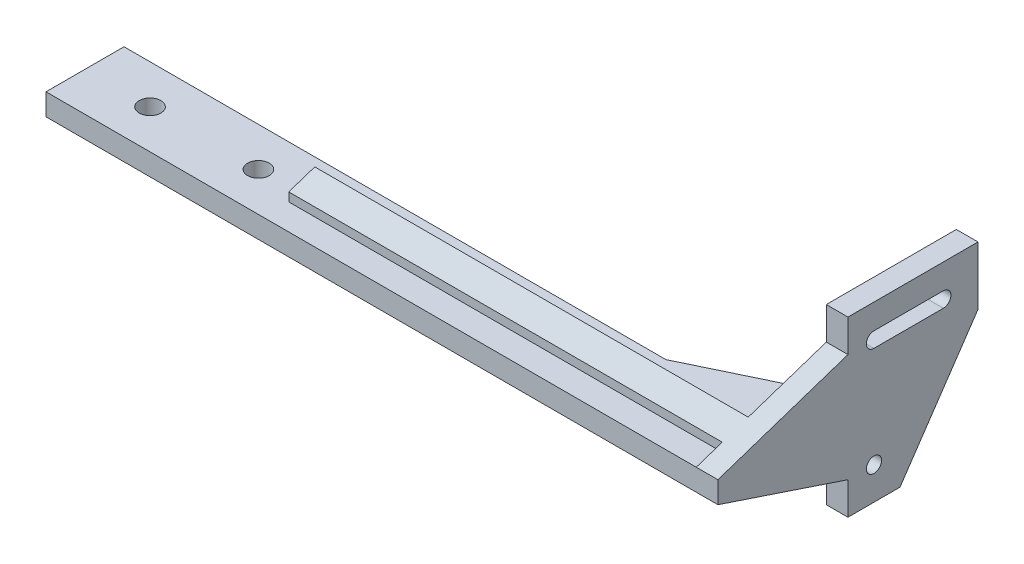
ISO-10303-21;
HEADER;
FILE_DESCRIPTION(('STEP AP214'),'2;1');
FILE_NAME('part.step','',(''),(''),'','','');
FILE_SCHEMA(('AUTOMOTIVE_DESIGN { 1 0 10303 214 1 1 1 1 }'));
ENDSEC;
DATA;
#1=APPLICATION_CONTEXT('core data for automotive mechanical design processes');
#2=APPLICATION_PROTOCOL_DEFINITION('international standard','automotive_design',2000,#1);
#3=PRODUCT_CONTEXT('',#1,'mechanical');
#4=PRODUCT('Part','Part','',(#3));
#5=PRODUCT_RELATED_PRODUCT_CATEGORY('part','',(#4));
#6=PRODUCT_DEFINITION_FORMATION('','',#4);
#7=PRODUCT_DEFINITION_CONTEXT('part definition',#1,'design');
#8=PRODUCT_DEFINITION('design','',#6,#7);
#9=PRODUCT_DEFINITION_SHAPE('','',#8);
#10=(LENGTH_UNIT() NAMED_UNIT(*) SI_UNIT(.MILLI.,.METRE.));
#11=(NAMED_UNIT(*) PLANE_ANGLE_UNIT() SI_UNIT($,.RADIAN.));
#12=(NAMED_UNIT(*) SI_UNIT($,.STERADIAN.) SOLID_ANGLE_UNIT());
#13=UNCERTAINTY_MEASURE_WITH_UNIT(LENGTH_MEASURE(1.E-05),#10,'distance_accuracy_value','');
#14=(GEOMETRIC_REPRESENTATION_CONTEXT(3) GLOBAL_UNCERTAINTY_ASSIGNED_CONTEXT((#13)) GLOBAL_UNIT_ASSIGNED_CONTEXT((#10,
#11,#12)) REPRESENTATION_CONTEXT('',''));
#15=CARTESIAN_POINT('',(0.,0.,0.));
#16=DIRECTION('',(0.,0.,1.));
#17=DIRECTION('',(1.,0.,0.));
#18=AXIS2_PLACEMENT_3D('',#15,#16,#17);
#19=CARTESIAN_POINT('',(0.,5.,0.));
#20=DIRECTION('',(0.,1.,0.));
#21=DIRECTION('',(0.,0.,1.));
#22=AXIS2_PLACEMENT_3D('',#19,#20,#21);
#23=PLANE('',#22);
#24=CARTESIAN_POINT('',(15.,5.,9.));
#25=DIRECTION('',(0.,1.,0.));
#26=DIRECTION('',(0.,0.,1.));
#27=AXIS2_PLACEMENT_3D('',#24,#25,#26);
#28=CIRCLE('',#27,2.5);
#29=CARTESIAN_POINT('',(15.,5.,11.5));
#30=VERTEX_POINT('',#29);
#31=EDGE_CURVE('E392',#30,#30,#28,.T.);
#32=ORIENTED_EDGE('',*,*,#31,.F.);
#33=EDGE_LOOP('',(#32));
#34=FACE_BOUND('',#33,.T.);
#35=CARTESIAN_POINT('',(40.,5.,8.99999999999999));
#36=DIRECTION('',(0.,1.,0.));
#37=DIRECTION('',(0.,0.,1.));
#38=AXIS2_PLACEMENT_3D('',#35,#36,#37);
#39=CIRCLE('',#38,2.5);
#40=CARTESIAN_POINT('',(40.,5.,11.5));
#41=VERTEX_POINT('',#40);
#42=EDGE_CURVE('E388',#41,#41,#39,.T.);
#43=ORIENTED_EDGE('',*,*,#42,.F.);
#44=EDGE_LOOP('',(#43));
#45=FACE_BOUND('',#44,.T.);
#46=DIRECTION('',(0.,0.,-1.));
#47=VECTOR('',#46,1.);
#48=CARTESIAN_POINT('',(150.,5.,18.));
#49=LINE('',#48,#47);
#50=CARTESIAN_POINT('',(150.,5.,18.));
#51=VERTEX_POINT('',#50);
#52=CARTESIAN_POINT('',(150.,5.,12.));
#53=VERTEX_POINT('',#52);
#54=EDGE_CURVE('E412',#51,#53,#49,.T.);
#55=ORIENTED_EDGE('',*,*,#54,.T.);
#56=DIRECTION('',(1.,0.,0.));
#57=VECTOR('',#56,1.);
#58=CARTESIAN_POINT('',(50.,5.,12.));
#59=LINE('',#58,#57);
#60=CARTESIAN_POINT('',(50.,5.,12.));
#61=VERTEX_POINT('',#60);
#62=EDGE_CURVE('E244',#61,#53,#59,.T.);
#63=ORIENTED_EDGE('',*,*,#62,.F.);
#64=DIRECTION('',(0.,0.,1.));
#65=VECTOR('',#64,1.);
#66=CARTESIAN_POINT('',(50.,5.,12.));
#67=LINE('',#66,#65);
#68=CARTESIAN_POINT('',(50.,5.,5.99999999999999));
#69=VERTEX_POINT('',#68);
#70=EDGE_CURVE('E220',#69,#61,#67,.T.);
#71=ORIENTED_EDGE('',*,*,#70,.F.);
#72=DIRECTION('',(1.,0.,0.));
#73=VECTOR('',#72,1.);
#74=CARTESIAN_POINT('',(50.,5.,5.99999999999999));
#75=LINE('',#74,#73);
#76=CARTESIAN_POINT('',(150.,5.,5.99999999999999));
#77=VERTEX_POINT('',#76);
#78=EDGE_CURVE('E232',#69,#77,#75,.T.);
#79=ORIENTED_EDGE('',*,*,#78,.T.);
#80=CARTESIAN_POINT('',(150.,5.,-12.));
#81=VERTEX_POINT('',#80);
#82=EDGE_CURVE('E55',#77,#81,#49,.T.);
#83=ORIENTED_EDGE('',*,*,#82,.T.);
#84=DIRECTION('',(-0.901523057468274,0.,0.432731067584771));
#85=VECTOR('',#84,1.);
#86=CARTESIAN_POINT('',(150.,5.,-12.));
#87=LINE('',#86,#85);
#88=CARTESIAN_POINT('',(125.,5.,0.));
#89=VERTEX_POINT('',#88);
#90=EDGE_CURVE('E215',#81,#89,#87,.T.);
#91=ORIENTED_EDGE('',*,*,#90,.T.);
#92=DIRECTION('',(-1.,0.,0.));
#93=VECTOR('',#92,1.);
#94=CARTESIAN_POINT('',(150.,5.,0.));
#95=LINE('',#94,#93);
#96=CARTESIAN_POINT('',(0.,5.,0.));
#97=VERTEX_POINT('',#96);
#98=EDGE_CURVE('E200',#89,#97,#95,.T.);
#99=ORIENTED_EDGE('',*,*,#98,.T.);
#100=DIRECTION('',(0.,0.,1.));
#101=VECTOR('',#100,1.);
#102=CARTESIAN_POINT('',(0.,5.,0.));
#103=LINE('',#102,#101);
#104=CARTESIAN_POINT('',(0.,5.,18.));
#105=VERTEX_POINT('',#104);
#106=EDGE_CURVE('E405',#97,#105,#103,.T.);
#107=ORIENTED_EDGE('',*,*,#106,.T.);
#108=DIRECTION('',(1.,0.,0.));
#109=VECTOR('',#108,1.);
#110=CARTESIAN_POINT('',(0.,5.,18.));
#111=LINE('',#110,#109);
#112=EDGE_CURVE('E408',#105,#51,#111,.T.);
#113=ORIENTED_EDGE('',*,*,#112,.T.);
#114=EDGE_LOOP('',(#55,#63,#71,#79,#83,#91,#99,#107,#113));
#115=FACE_BOUND('',#114,.T.);
#116=ADVANCED_FACE('F39',(#34,#45,#115),#23,.T.);
#117=CARTESIAN_POINT('',(150.,0.,0.));
#118=DIRECTION('',(1.,0.,0.));
#119=DIRECTION('',(0.,0.,-1.));
#120=AXIS2_PLACEMENT_3D('',#117,#118,#119);
#121=PLANE('',#120);
#122=DIRECTION('',(0.,1.,0.));
#123=VECTOR('',#122,1.);
#124=CARTESIAN_POINT('',(150.,7.00000000000001,12.));
#125=LINE('',#124,#123);
#126=CARTESIAN_POINT('',(150.,7.,12.));
#127=VERTEX_POINT('',#126);
#128=EDGE_CURVE('E208',#53,#127,#125,.T.);
#129=ORIENTED_EDGE('',*,*,#128,.F.);
#130=ORIENTED_EDGE('',*,*,#54,.F.);
#131=DIRECTION('',(0.,-0.316227766016838,0.948683298050514));
#132=VECTOR('',#131,1.);
#133=CARTESIAN_POINT('',(150.,5.,18.));
#134=LINE('',#133,#132);
#135=EDGE_CURVE('E332',#127,#51,#134,.T.);
#136=ORIENTED_EDGE('',*,*,#135,.F.);
#137=EDGE_LOOP('',(#129,#130,#136));
#138=FACE_BOUND('',#137,.T.);
#139=ADVANCED_FACE('F439',(#138),#121,.F.);
#140=DIRECTION('',(0.,0.,-1.));
#141=VECTOR('',#140,1.);
#142=CARTESIAN_POINT('',(150.,16.75,-18.));
#143=LINE('',#142,#141);
#144=CARTESIAN_POINT('',(150.,16.75,-18.));
#145=VERTEX_POINT('',#144);
#146=CARTESIAN_POINT('',(150.,16.75,-34.));
#147=VERTEX_POINT('',#146);
#148=EDGE_CURVE('E260',#145,#147,#143,.T.);
#149=ORIENTED_EDGE('',*,*,#148,.F.);
#150=CARTESIAN_POINT('',(150.,15.,-18.));
#151=DIRECTION('',(1.,0.,0.));
#152=DIRECTION('',(0.,0.,-1.));
#153=AXIS2_PLACEMENT_3D('',#150,#151,#152);
#154=CIRCLE('',#153,1.75);
#155=CARTESIAN_POINT('',(150.,13.25,-18.));
#156=VERTEX_POINT('',#155);
#157=EDGE_CURVE('E264',#156,#145,#154,.F.);
#158=ORIENTED_EDGE('',*,*,#157,.F.);
#159=DIRECTION('',(0.,0.,1.));
#160=VECTOR('',#159,1.);
#161=CARTESIAN_POINT('',(150.,13.25,-18.));
#162=LINE('',#161,#160);
#163=CARTESIAN_POINT('',(150.,13.25,-34.));
#164=VERTEX_POINT('',#163);
#165=EDGE_CURVE('E253',#164,#156,#162,.T.);
#166=ORIENTED_EDGE('',*,*,#165,.F.);
#167=CARTESIAN_POINT('',(150.,15.,-34.));
#168=DIRECTION('',(1.,0.,0.));
#169=DIRECTION('',(0.,0.,-1.));
#170=AXIS2_PLACEMENT_3D('',#167,#168,#169);
#171=CIRCLE('',#170,1.75);
#172=EDGE_CURVE('E247',#147,#164,#171,.F.);
#173=ORIENTED_EDGE('',*,*,#172,.F.);
#174=EDGE_LOOP('',(#149,#158,#166,#173));
#175=FACE_BOUND('',#174,.T.);
#176=CARTESIAN_POINT('',(150.,-10.,-18.));
#177=DIRECTION('',(1.,0.,0.));
#178=DIRECTION('',(0.,0.,-1.));
#179=AXIS2_PLACEMENT_3D('',#176,#177,#178);
#180=CIRCLE('',#179,1.75);
#181=CARTESIAN_POINT('',(150.,-10.,-19.75));
#182=VERTEX_POINT('',#181);
#183=EDGE_CURVE('E252',#182,#182,#180,.F.);
#184=ORIENTED_EDGE('',*,*,#183,.F.);
#185=EDGE_LOOP('',(#184));
#186=FACE_BOUND('',#185,.T.);
#187=DIRECTION('',(0.,1.,0.));
#188=VECTOR('',#187,1.);
#189=CARTESIAN_POINT('',(150.,-27.7308492477241,-12.));
#190=LINE('',#189,#188);
#191=CARTESIAN_POINT('',(150.,0.,-12.));
#192=VERTEX_POINT('',#191);
#193=EDGE_CURVE('E204',#192,#81,#190,.T.);
#194=ORIENTED_EDGE('',*,*,#193,.T.);
#195=ORIENTED_EDGE('',*,*,#82,.F.);
#196=DIRECTION('',(0.,-1.,0.));
#197=VECTOR('',#196,1.);
#198=CARTESIAN_POINT('',(150.,9.00000000000001,5.99999999999999));
#199=LINE('',#198,#197);
#200=CARTESIAN_POINT('',(150.,9.00000000000001,5.99999999999999));
#201=VERTEX_POINT('',#200);
#202=EDGE_CURVE('E212',#201,#77,#199,.T.);
#203=ORIENTED_EDGE('',*,*,#202,.F.);
#204=CARTESIAN_POINT('',(150.,15.,-12.));
#205=VERTEX_POINT('',#204);
#206=EDGE_CURVE('E333',#205,#201,#134,.T.);
#207=ORIENTED_EDGE('',*,*,#206,.F.);
#208=DIRECTION('',(0.,-1.,0.));
#209=VECTOR('',#208,1.);
#210=CARTESIAN_POINT('',(150.,15.,-12.));
#211=LINE('',#210,#209);
#212=CARTESIAN_POINT('',(150.,22.5,-12.));
#213=VERTEX_POINT('',#212);
#214=EDGE_CURVE('E257',#213,#205,#211,.T.);
#215=ORIENTED_EDGE('',*,*,#214,.F.);
#216=DIRECTION('',(0.,0.,1.));
#217=VECTOR('',#216,1.);
#218=CARTESIAN_POINT('',(150.,22.5,-24.));
#219=LINE('',#218,#217);
#220=CARTESIAN_POINT('',(150.,22.5,-42.));
#221=VERTEX_POINT('',#220);
#222=EDGE_CURVE('E304',#221,#213,#219,.T.);
#223=ORIENTED_EDGE('',*,*,#222,.F.);
#224=DIRECTION('',(0.,1.,0.));
#225=VECTOR('',#224,1.);
#226=CARTESIAN_POINT('',(150.,9.02980585679813,-42.));
#227=LINE('',#226,#225);
#228=CARTESIAN_POINT('',(150.,9.02980585679813,-42.));
#229=VERTEX_POINT('',#228);
#230=EDGE_CURVE('E349',#229,#221,#227,.T.);
#231=ORIENTED_EDGE('',*,*,#230,.F.);
#232=DIRECTION('',(0.,0.827510095016723,-0.561450837247051));
#233=VECTOR('',#232,1.);
#234=CARTESIAN_POINT('',(150.,-17.5,-24.));
#235=LINE('',#234,#233);
#236=CARTESIAN_POINT('',(150.,-17.5,-24.));
#237=VERTEX_POINT('',#236);
#238=EDGE_CURVE('E346',#237,#229,#235,.T.);
#239=ORIENTED_EDGE('',*,*,#238,.F.);
#240=DIRECTION('',(0.,0.,-1.));
#241=VECTOR('',#240,1.);
#242=CARTESIAN_POINT('',(150.,-17.5,-24.));
#243=LINE('',#242,#241);
#244=CARTESIAN_POINT('',(150.,-17.5,-12.));
#245=VERTEX_POINT('',#244);
#246=EDGE_CURVE('E343',#245,#237,#243,.T.);
#247=ORIENTED_EDGE('',*,*,#246,.F.);
#248=DIRECTION('',(0.,-1.,0.));
#249=VECTOR('',#248,1.);
#250=CARTESIAN_POINT('',(150.,-17.5,-12.));
#251=LINE('',#250,#249);
#252=CARTESIAN_POINT('',(150.,-10.,-12.));
#253=VERTEX_POINT('',#252);
#254=EDGE_CURVE('E340',#253,#245,#251,.T.);
#255=ORIENTED_EDGE('',*,*,#254,.F.);
#256=DIRECTION('',(0.,-0.316227766016838,-0.948683298050514));
#257=VECTOR('',#256,1.);
#258=CARTESIAN_POINT('',(150.,0.,18.));
#259=LINE('',#258,#257);
#260=CARTESIAN_POINT('',(150.,0.,18.));
#261=VERTEX_POINT('',#260);
#262=EDGE_CURVE('E337',#261,#253,#259,.T.);
#263=ORIENTED_EDGE('',*,*,#262,.F.);
#264=DIRECTION('',(0.,0.,-1.));
#265=VECTOR('',#264,1.);
#266=CARTESIAN_POINT('',(150.,0.,18.));
#267=LINE('',#266,#265);
#268=EDGE_CURVE('E62',#261,#192,#267,.T.);
#269=ORIENTED_EDGE('',*,*,#268,.T.);
#270=EDGE_LOOP('',(#194,#195,#203,#207,#215,#223,#231,#239,#247,#255,#263,#269));
#271=FACE_BOUND('',#270,.T.);
#272=ADVANCED_FACE('F458',(#175,#186,#271),#121,.F.);
#273=CARTESIAN_POINT('',(150.,5.,0.));
#274=DIRECTION('',(0.,0.,1.));
#275=DIRECTION('',(1.,0.,0.));
#276=AXIS2_PLACEMENT_3D('',#273,#274,#275);
#277=PLANE('',#276);
#278=ORIENTED_EDGE('',*,*,#98,.F.);
#279=DIRECTION('',(0.,1.,0.));
#280=VECTOR('',#279,1.);
#281=CARTESIAN_POINT('',(125.,-27.7308492477241,0.));
#282=LINE('',#281,#280);
#283=CARTESIAN_POINT('',(125.,0.,0.));
#284=VERTEX_POINT('',#283);
#285=EDGE_CURVE('E199',#284,#89,#282,.T.);
#286=ORIENTED_EDGE('',*,*,#285,.F.);
#287=DIRECTION('',(-1.,0.,0.));
#288=VECTOR('',#287,1.);
#289=CARTESIAN_POINT('',(150.,0.,0.));
#290=LINE('',#289,#288);
#291=CARTESIAN_POINT('',(0.,0.,0.));
#292=VERTEX_POINT('',#291);
#293=EDGE_CURVE('E185',#284,#292,#290,.T.);
#294=ORIENTED_EDGE('',*,*,#293,.T.);
#295=DIRECTION('',(0.,-1.,0.));
#296=VECTOR('',#295,1.);
#297=CARTESIAN_POINT('',(0.,5.,0.));
#298=LINE('',#297,#296);
#299=EDGE_CURVE('E11',#97,#292,#298,.T.);
#300=ORIENTED_EDGE('',*,*,#299,.F.);
#301=EDGE_LOOP('',(#278,#286,#294,#300));
#302=FACE_BOUND('',#301,.T.);
#303=ADVANCED_FACE('F41',(#302),#277,.F.);
#304=CARTESIAN_POINT('',(0.,5.,0.));
#305=DIRECTION('',(1.,0.,0.));
#306=DIRECTION('',(0.,0.,-1.));
#307=AXIS2_PLACEMENT_3D('',#304,#305,#306);
#308=PLANE('',#307);
#309=DIRECTION('',(0.,0.,1.));
#310=VECTOR('',#309,1.);
#311=CARTESIAN_POINT('',(0.,0.,0.));
#312=LINE('',#311,#310);
#313=CARTESIAN_POINT('',(0.,0.,18.));
#314=VERTEX_POINT('',#313);
#315=EDGE_CURVE('E192',#292,#314,#312,.T.);
#316=ORIENTED_EDGE('',*,*,#315,.T.);
#317=DIRECTION('',(0.,-1.,0.));
#318=VECTOR('',#317,1.);
#319=CARTESIAN_POINT('',(0.,5.,18.));
#320=LINE('',#319,#318);
#321=EDGE_CURVE('E48',#105,#314,#320,.T.);
#322=ORIENTED_EDGE('',*,*,#321,.F.);
#323=ORIENTED_EDGE('',*,*,#106,.F.);
#324=ORIENTED_EDGE('',*,*,#299,.T.);
#325=EDGE_LOOP('',(#316,#322,#323,#324));
#326=FACE_BOUND('',#325,.T.);
#327=ADVANCED_FACE('F432',(#326),#308,.F.);
#328=CARTESIAN_POINT('',(0.,5.,18.));
#329=DIRECTION('',(0.,0.,-1.));
#330=DIRECTION('',(-1.,0.,0.));
#331=AXIS2_PLACEMENT_3D('',#328,#329,#330);
#332=PLANE('',#331);
#333=DIRECTION('',(1.,0.,0.));
#334=VECTOR('',#333,1.);
#335=CARTESIAN_POINT('',(0.,0.,18.));
#336=LINE('',#335,#334);
#337=EDGE_CURVE('E418',#314,#261,#336,.T.);
#338=ORIENTED_EDGE('',*,*,#337,.T.);
#339=DIRECTION('',(-1.,0.,0.));
#340=VECTOR('',#339,1.);
#341=CARTESIAN_POINT('',(155.,0.,18.));
#342=LINE('',#341,#340);
#343=CARTESIAN_POINT('',(155.,0.,18.));
#344=VERTEX_POINT('',#343);
#345=EDGE_CURVE('E373',#344,#261,#342,.T.);
#346=ORIENTED_EDGE('',*,*,#345,.F.);
#347=DIRECTION('',(0.,-1.,0.));
#348=VECTOR('',#347,1.);
#349=CARTESIAN_POINT('',(155.,5.,18.));
#350=LINE('',#349,#348);
#351=CARTESIAN_POINT('',(155.,5.,18.));
#352=VERTEX_POINT('',#351);
#353=EDGE_CURVE('E310',#352,#344,#350,.T.);
#354=ORIENTED_EDGE('',*,*,#353,.F.);
#355=DIRECTION('',(-1.,0.,0.));
#356=VECTOR('',#355,1.);
#357=CARTESIAN_POINT('',(155.,5.,18.));
#358=LINE('',#357,#356);
#359=EDGE_CURVE('E376',#352,#51,#358,.T.);
#360=ORIENTED_EDGE('',*,*,#359,.T.);
#361=ORIENTED_EDGE('',*,*,#112,.F.);
#362=ORIENTED_EDGE('',*,*,#321,.T.);
#363=EDGE_LOOP('',(#338,#346,#354,#360,#361,#362));
#364=FACE_BOUND('',#363,.T.);
#365=ADVANCED_FACE('F428',(#364),#332,.F.);
#366=CARTESIAN_POINT('',(0.,0.,0.));
#367=DIRECTION('',(0.,1.,0.));
#368=DIRECTION('',(0.,0.,1.));
#369=AXIS2_PLACEMENT_3D('',#366,#367,#368);
#370=PLANE('',#369);
#371=CARTESIAN_POINT('',(15.,0.,9.));
#372=DIRECTION('',(0.,1.,0.));
#373=DIRECTION('',(0.,0.,1.));
#374=AXIS2_PLACEMENT_3D('',#371,#372,#373);
#375=CIRCLE('',#374,2.5);
#376=CARTESIAN_POINT('',(15.,0.,11.5));
#377=VERTEX_POINT('',#376);
#378=EDGE_CURVE('E196',#377,#377,#375,.T.);
#379=ORIENTED_EDGE('',*,*,#378,.T.);
#380=EDGE_LOOP('',(#379));
#381=FACE_BOUND('',#380,.T.);
#382=CARTESIAN_POINT('',(40.,0.,8.99999999999999));
#383=DIRECTION('',(0.,1.,0.));
#384=DIRECTION('',(0.,0.,1.));
#385=AXIS2_PLACEMENT_3D('',#382,#383,#384);
#386=CIRCLE('',#385,2.5);
#387=CARTESIAN_POINT('',(40.,0.,11.5));
#388=VERTEX_POINT('',#387);
#389=EDGE_CURVE('E396',#388,#388,#386,.T.);
#390=ORIENTED_EDGE('',*,*,#389,.T.);
#391=EDGE_LOOP('',(#390));
#392=FACE_BOUND('',#391,.T.);
#393=ORIENTED_EDGE('',*,*,#293,.F.);
#394=DIRECTION('',(0.901523057468274,0.,-0.432731067584771));
#395=VECTOR('',#394,1.);
#396=CARTESIAN_POINT('',(150.,0.,-12.));
#397=LINE('',#396,#395);
#398=EDGE_CURVE('E189',#284,#192,#397,.T.);
#399=ORIENTED_EDGE('',*,*,#398,.T.);
#400=ORIENTED_EDGE('',*,*,#268,.F.);
#401=ORIENTED_EDGE('',*,*,#337,.F.);
#402=ORIENTED_EDGE('',*,*,#315,.F.);
#403=EDGE_LOOP('',(#393,#399,#400,#401,#402));
#404=FACE_BOUND('',#403,.T.);
#405=ADVANCED_FACE('F187',(#381,#392,#404),#370,.F.);
#406=CARTESIAN_POINT('',(40.,0.,8.99999999999999));
#407=DIRECTION('',(0.,1.,0.));
#408=DIRECTION('',(0.,0.,1.));
#409=AXIS2_PLACEMENT_3D('',#406,#407,#408);
#410=CYLINDRICAL_SURFACE('',#409,2.5);
#411=ORIENTED_EDGE('',*,*,#389,.F.);
#412=EDGE_LOOP('',(#411));
#413=FACE_BOUND('',#412,.T.);
#414=ORIENTED_EDGE('',*,*,#42,.T.);
#415=EDGE_LOOP('',(#414));
#416=FACE_BOUND('',#415,.T.);
#417=ADVANCED_FACE('F519',(#413,#416),#410,.F.);
#418=CARTESIAN_POINT('',(15.,0.,9.));
#419=DIRECTION('',(0.,1.,0.));
#420=DIRECTION('',(0.,0.,1.));
#421=AXIS2_PLACEMENT_3D('',#418,#419,#420);
#422=CYLINDRICAL_SURFACE('',#421,2.5);
#423=ORIENTED_EDGE('',*,*,#378,.F.);
#424=EDGE_LOOP('',(#423));
#425=FACE_BOUND('',#424,.T.);
#426=ORIENTED_EDGE('',*,*,#31,.T.);
#427=EDGE_LOOP('',(#426));
#428=FACE_BOUND('',#427,.T.);
#429=ADVANCED_FACE('F551',(#425,#428),#422,.F.);
#430=CARTESIAN_POINT('',(155.,15.,-12.));
#431=DIRECTION('',(0.,0.,-1.));
#432=DIRECTION('',(0.,1.,0.));
#433=AXIS2_PLACEMENT_3D('',#430,#431,#432);
#434=PLANE('',#433);
#435=ORIENTED_EDGE('',*,*,#214,.T.);
#436=DIRECTION('',(-1.,0.,0.));
#437=VECTOR('',#436,1.);
#438=CARTESIAN_POINT('',(155.,15.,-12.));
#439=LINE('',#438,#437);
#440=CARTESIAN_POINT('',(155.,15.,-12.));
#441=VERTEX_POINT('',#440);
#442=EDGE_CURVE('E380',#441,#205,#439,.T.);
#443=ORIENTED_EDGE('',*,*,#442,.F.);
#444=DIRECTION('',(0.,-1.,0.));
#445=VECTOR('',#444,1.);
#446=CARTESIAN_POINT('',(155.,15.,-12.));
#447=LINE('',#446,#445);
#448=CARTESIAN_POINT('',(155.,22.5,-12.));
#449=VERTEX_POINT('',#448);
#450=EDGE_CURVE('E303',#449,#441,#447,.T.);
#451=ORIENTED_EDGE('',*,*,#450,.F.);
#452=DIRECTION('',(-1.,0.,0.));
#453=VECTOR('',#452,1.);
#454=CARTESIAN_POINT('',(155.,22.5,-12.));
#455=LINE('',#454,#453);
#456=EDGE_CURVE('E384',#449,#213,#455,.T.);
#457=ORIENTED_EDGE('',*,*,#456,.T.);
#458=EDGE_LOOP('',(#435,#443,#451,#457));
#459=FACE_BOUND('',#458,.T.);
#460=ADVANCED_FACE('F463',(#459),#434,.F.);
#461=CARTESIAN_POINT('',(155.,5.,18.));
#462=DIRECTION('',(0.,-0.948683298050514,-0.316227766016838));
#463=DIRECTION('',(0.,0.316227766016838,-0.948683298050514));
#464=AXIS2_PLACEMENT_3D('',#461,#462,#463);
#465=PLANE('',#464);
#466=ORIENTED_EDGE('',*,*,#206,.T.);
#467=DIRECTION('',(1.,0.,0.));
#468=VECTOR('',#467,1.);
#469=CARTESIAN_POINT('',(50.,9.00000000000001,5.99999999999999));
#470=LINE('',#469,#468);
#471=CARTESIAN_POINT('',(50.,9.00000000000001,5.99999999999999));
#472=VERTEX_POINT('',#471);
#473=EDGE_CURVE('E238',#472,#201,#470,.T.);
#474=ORIENTED_EDGE('',*,*,#473,.F.);
#475=DIRECTION('',(0.,0.316227766016838,-0.948683298050514));
#476=VECTOR('',#475,1.);
#477=CARTESIAN_POINT('',(50.,9.00000000000001,5.99999999999999));
#478=LINE('',#477,#476);
#479=CARTESIAN_POINT('',(50.,7.00000000000001,12.));
#480=VERTEX_POINT('',#479);
#481=EDGE_CURVE('E227',#480,#472,#478,.T.);
#482=ORIENTED_EDGE('',*,*,#481,.F.);
#483=DIRECTION('',(1.,0.,0.));
#484=VECTOR('',#483,1.);
#485=CARTESIAN_POINT('',(50.,7.00000000000001,12.));
#486=LINE('',#485,#484);
#487=EDGE_CURVE('E241',#480,#127,#486,.T.);
#488=ORIENTED_EDGE('',*,*,#487,.T.);
#489=ORIENTED_EDGE('',*,*,#135,.T.);
#490=ORIENTED_EDGE('',*,*,#359,.F.);
#491=DIRECTION('',(0.,-0.316227766016838,0.948683298050514));
#492=VECTOR('',#491,1.);
#493=CARTESIAN_POINT('',(155.,5.,18.));
#494=LINE('',#493,#492);
#495=EDGE_CURVE('E307',#441,#352,#494,.T.);
#496=ORIENTED_EDGE('',*,*,#495,.F.);
#497=ORIENTED_EDGE('',*,*,#442,.T.);
#498=EDGE_LOOP('',(#466,#474,#482,#488,#489,#490,#496,#497));
#499=FACE_BOUND('',#498,.T.);
#500=ADVANCED_FACE('F444',(#499),#465,.F.);
#501=CARTESIAN_POINT('',(155.,0.,18.));
#502=DIRECTION('',(0.,0.948683298050514,-0.316227766016838));
#503=DIRECTION('',(0.,0.316227766016838,0.948683298050514));
#504=AXIS2_PLACEMENT_3D('',#501,#502,#503);
#505=PLANE('',#504);
#506=ORIENTED_EDGE('',*,*,#262,.T.);
#507=DIRECTION('',(-1.,0.,0.));
#508=VECTOR('',#507,1.);
#509=CARTESIAN_POINT('',(155.,-10.,-12.));
#510=LINE('',#509,#508);
#511=CARTESIAN_POINT('',(155.,-10.,-12.));
#512=VERTEX_POINT('',#511);
#513=EDGE_CURVE('E369',#512,#253,#510,.T.);
#514=ORIENTED_EDGE('',*,*,#513,.F.);
#515=DIRECTION('',(0.,-0.316227766016838,-0.948683298050514));
#516=VECTOR('',#515,1.);
#517=CARTESIAN_POINT('',(155.,0.,18.));
#518=LINE('',#517,#516);
#519=EDGE_CURVE('E313',#344,#512,#518,.T.);
#520=ORIENTED_EDGE('',*,*,#519,.F.);
#521=ORIENTED_EDGE('',*,*,#345,.T.);
#522=EDGE_LOOP('',(#506,#514,#520,#521));
#523=FACE_BOUND('',#522,.T.);
#524=ADVANCED_FACE('F491',(#523),#505,.F.);
#525=CARTESIAN_POINT('',(155.,-17.5,-12.));
#526=DIRECTION('',(0.,0.,-1.));
#527=DIRECTION('',(0.,1.,0.));
#528=AXIS2_PLACEMENT_3D('',#525,#526,#527);
#529=PLANE('',#528);
#530=ORIENTED_EDGE('',*,*,#254,.T.);
#531=DIRECTION('',(-1.,0.,0.));
#532=VECTOR('',#531,1.);
#533=CARTESIAN_POINT('',(155.,-17.5,-12.));
#534=LINE('',#533,#532);
#535=CARTESIAN_POINT('',(155.,-17.5,-12.));
#536=VERTEX_POINT('',#535);
#537=EDGE_CURVE('E365',#536,#245,#534,.T.);
#538=ORIENTED_EDGE('',*,*,#537,.F.);
#539=DIRECTION('',(0.,-1.,0.));
#540=VECTOR('',#539,1.);
#541=CARTESIAN_POINT('',(155.,-17.5,-12.));
#542=LINE('',#541,#540);
#543=EDGE_CURVE('E316',#512,#536,#542,.T.);
#544=ORIENTED_EDGE('',*,*,#543,.F.);
#545=ORIENTED_EDGE('',*,*,#513,.T.);
#546=EDGE_LOOP('',(#530,#538,#544,#545));
#547=FACE_BOUND('',#546,.T.);
#548=ADVANCED_FACE('F487',(#547),#529,.F.);
#549=CARTESIAN_POINT('',(155.,-17.5,-24.));
#550=DIRECTION('',(0.,1.,0.));
#551=DIRECTION('',(0.,0.,1.));
#552=AXIS2_PLACEMENT_3D('',#549,#550,#551);
#553=PLANE('',#552);
#554=ORIENTED_EDGE('',*,*,#246,.T.);
#555=DIRECTION('',(-1.,0.,0.));
#556=VECTOR('',#555,1.);
#557=CARTESIAN_POINT('',(155.,-17.5,-24.));
#558=LINE('',#557,#556);
#559=CARTESIAN_POINT('',(155.,-17.5,-24.));
#560=VERTEX_POINT('',#559);
#561=EDGE_CURVE('E361',#560,#237,#558,.T.);
#562=ORIENTED_EDGE('',*,*,#561,.F.);
#563=DIRECTION('',(0.,0.,-1.));
#564=VECTOR('',#563,1.);
#565=CARTESIAN_POINT('',(155.,-17.5,-24.));
#566=LINE('',#565,#564);
#567=EDGE_CURVE('E319',#536,#560,#566,.T.);
#568=ORIENTED_EDGE('',*,*,#567,.F.);
#569=ORIENTED_EDGE('',*,*,#537,.T.);
#570=EDGE_LOOP('',(#554,#562,#568,#569));
#571=FACE_BOUND('',#570,.T.);
#572=ADVANCED_FACE('F482',(#571),#553,.F.);
#573=CARTESIAN_POINT('',(155.,-17.5,-24.));
#574=DIRECTION('',(0.,0.561450837247051,0.827510095016723));
#575=DIRECTION('',(0.,-0.827510095016723,0.561450837247051));
#576=AXIS2_PLACEMENT_3D('',#573,#574,#575);
#577=PLANE('',#576);
#578=ORIENTED_EDGE('',*,*,#238,.T.);
#579=DIRECTION('',(-1.,0.,0.));
#580=VECTOR('',#579,1.);
#581=CARTESIAN_POINT('',(155.,9.02980585679813,-42.));
#582=LINE('',#581,#580);
#583=CARTESIAN_POINT('',(155.,9.02980585679813,-42.));
#584=VERTEX_POINT('',#583);
#585=EDGE_CURVE('E357',#584,#229,#582,.T.);
#586=ORIENTED_EDGE('',*,*,#585,.F.);
#587=DIRECTION('',(0.,0.827510095016723,-0.561450837247051));
#588=VECTOR('',#587,1.);
#589=CARTESIAN_POINT('',(155.,-17.5,-24.));
#590=LINE('',#589,#588);
#591=EDGE_CURVE('E322',#560,#584,#590,.T.);
#592=ORIENTED_EDGE('',*,*,#591,.F.);
#593=ORIENTED_EDGE('',*,*,#561,.T.);
#594=EDGE_LOOP('',(#578,#586,#592,#593));
#595=FACE_BOUND('',#594,.T.);
#596=ADVANCED_FACE('F477',(#595),#577,.F.);
#597=CARTESIAN_POINT('',(155.,9.02980585679813,-42.));
#598=DIRECTION('',(0.,0.,1.));
#599=DIRECTION('',(1.,0.,0.));
#600=AXIS2_PLACEMENT_3D('',#597,#598,#599);
#601=PLANE('',#600);
#602=ORIENTED_EDGE('',*,*,#230,.T.);
#603=DIRECTION('',(-1.,0.,0.));
#604=VECTOR('',#603,1.);
#605=CARTESIAN_POINT('',(155.,22.5,-42.));
#606=LINE('',#605,#604);
#607=CARTESIAN_POINT('',(155.,22.5,-42.));
#608=VERTEX_POINT('',#607);
#609=EDGE_CURVE('E329',#608,#221,#606,.T.);
#610=ORIENTED_EDGE('',*,*,#609,.F.);
#611=DIRECTION('',(0.,1.,0.));
#612=VECTOR('',#611,1.);
#613=CARTESIAN_POINT('',(155.,9.02980585679813,-42.));
#614=LINE('',#613,#612);
#615=EDGE_CURVE('E325',#584,#608,#614,.T.);
#616=ORIENTED_EDGE('',*,*,#615,.F.);
#617=ORIENTED_EDGE('',*,*,#585,.T.);
#618=EDGE_LOOP('',(#602,#610,#616,#617));
#619=FACE_BOUND('',#618,.T.);
#620=ADVANCED_FACE('F473',(#619),#601,.F.);
#621=CARTESIAN_POINT('',(155.,22.5,-24.));
#622=DIRECTION('',(0.,-1.,0.));
#623=DIRECTION('',(0.,0.,-1.));
#624=AXIS2_PLACEMENT_3D('',#621,#622,#623);
#625=PLANE('',#624);
#626=ORIENTED_EDGE('',*,*,#222,.T.);
#627=ORIENTED_EDGE('',*,*,#456,.F.);
#628=DIRECTION('',(0.,0.,1.));
#629=VECTOR('',#628,1.);
#630=CARTESIAN_POINT('',(155.,22.5,-12.));
#631=LINE('',#630,#629);
#632=EDGE_CURVE('E299',#608,#449,#631,.T.);
#633=ORIENTED_EDGE('',*,*,#632,.F.);
#634=ORIENTED_EDGE('',*,*,#609,.T.);
#635=EDGE_LOOP('',(#626,#627,#633,#634));
#636=FACE_BOUND('',#635,.T.);
#637=ADVANCED_FACE('F469',(#636),#625,.F.);
#638=CARTESIAN_POINT('',(155.,0.,0.));
#639=DIRECTION('',(1.,0.,0.));
#640=DIRECTION('',(0.,0.,-1.));
#641=AXIS2_PLACEMENT_3D('',#638,#639,#640);
#642=PLANE('',#641);
#643=CARTESIAN_POINT('',(155.,-10.,-18.));
#644=DIRECTION('',(1.,0.,0.));
#645=DIRECTION('',(0.,0.,-1.));
#646=AXIS2_PLACEMENT_3D('',#643,#644,#645);
#647=CIRCLE('',#646,1.75);
#648=CARTESIAN_POINT('',(155.,-10.,-19.75));
#649=VERTEX_POINT('',#648);
#650=EDGE_CURVE('E248',#649,#649,#647,.T.);
#651=ORIENTED_EDGE('',*,*,#650,.F.);
#652=EDGE_LOOP('',(#651));
#653=FACE_BOUND('',#652,.T.);
#654=CARTESIAN_POINT('',(155.,15.,-18.));
#655=DIRECTION('',(1.,0.,0.));
#656=DIRECTION('',(0.,0.,-1.));
#657=AXIS2_PLACEMENT_3D('',#654,#655,#656);
#658=CIRCLE('',#657,1.75);
#659=CARTESIAN_POINT('',(155.,16.75,-18.));
#660=VERTEX_POINT('',#659);
#661=CARTESIAN_POINT('',(155.,13.25,-18.));
#662=VERTEX_POINT('',#661);
#663=EDGE_CURVE('E268',#660,#662,#658,.T.);
#664=ORIENTED_EDGE('',*,*,#663,.F.);
#665=DIRECTION('',(0.,0.,1.));
#666=VECTOR('',#665,1.);
#667=CARTESIAN_POINT('',(155.,16.75,-18.));
#668=LINE('',#667,#666);
#669=CARTESIAN_POINT('',(155.,16.75,-34.));
#670=VERTEX_POINT('',#669);
#671=EDGE_CURVE('E279',#670,#660,#668,.T.);
#672=ORIENTED_EDGE('',*,*,#671,.F.);
#673=CARTESIAN_POINT('',(155.,15.,-34.));
#674=DIRECTION('',(1.,0.,0.));
#675=DIRECTION('',(0.,0.,-1.));
#676=AXIS2_PLACEMENT_3D('',#673,#674,#675);
#677=CIRCLE('',#676,1.75);
#678=CARTESIAN_POINT('',(155.,13.25,-34.));
#679=VERTEX_POINT('',#678);
#680=EDGE_CURVE('E275',#679,#670,#677,.T.);
#681=ORIENTED_EDGE('',*,*,#680,.F.);
#682=DIRECTION('',(0.,0.,-1.));
#683=VECTOR('',#682,1.);
#684=CARTESIAN_POINT('',(155.,13.25,-18.));
#685=LINE('',#684,#683);
#686=EDGE_CURVE('E271',#662,#679,#685,.T.);
#687=ORIENTED_EDGE('',*,*,#686,.F.);
#688=EDGE_LOOP('',(#664,#672,#681,#687));
#689=FACE_BOUND('',#688,.T.);
#690=ORIENTED_EDGE('',*,*,#632,.T.);
#691=ORIENTED_EDGE('',*,*,#450,.T.);
#692=ORIENTED_EDGE('',*,*,#495,.T.);
#693=ORIENTED_EDGE('',*,*,#353,.T.);
#694=ORIENTED_EDGE('',*,*,#519,.T.);
#695=ORIENTED_EDGE('',*,*,#543,.T.);
#696=ORIENTED_EDGE('',*,*,#567,.T.);
#697=ORIENTED_EDGE('',*,*,#591,.T.);
#698=ORIENTED_EDGE('',*,*,#615,.T.);
#699=EDGE_LOOP('',(#690,#691,#692,#693,#694,#695,#696,#697,#698));
#700=FACE_BOUND('',#699,.T.);
#701=ADVANCED_FACE('F493',(#653,#689,#700),#642,.T.);
#702=CARTESIAN_POINT('',(-0.001000000000001,15.,-18.));
#703=DIRECTION('',(1.,0.,0.));
#704=DIRECTION('',(0.,0.,-1.));
#705=AXIS2_PLACEMENT_3D('',#702,#703,#704);
#706=CYLINDRICAL_SURFACE('',#705,1.75);
#707=ORIENTED_EDGE('',*,*,#157,.T.);
#708=DIRECTION('',(1.,0.,0.));
#709=VECTOR('',#708,1.);
#710=CARTESIAN_POINT('',(-0.001000000000001,16.75,-18.));
#711=LINE('',#710,#709);
#712=EDGE_CURVE('E284',#145,#660,#711,.T.);
#713=ORIENTED_EDGE('',*,*,#712,.T.);
#714=ORIENTED_EDGE('',*,*,#663,.T.);
#715=DIRECTION('',(1.,0.,0.));
#716=VECTOR('',#715,1.);
#717=CARTESIAN_POINT('',(-0.001000000000001,13.25,-18.));
#718=LINE('',#717,#716);
#719=EDGE_CURVE('E283',#156,#662,#718,.T.);
#720=ORIENTED_EDGE('',*,*,#719,.F.);
#721=EDGE_LOOP('',(#707,#713,#714,#720));
#722=FACE_BOUND('',#721,.T.);
#723=ADVANCED_FACE('F495',(#722),#706,.F.);
#724=CARTESIAN_POINT('',(-0.001000000000001,16.75,-18.));
#725=DIRECTION('',(0.,1.,0.));
#726=DIRECTION('',(0.,0.,1.));
#727=AXIS2_PLACEMENT_3D('',#724,#725,#726);
#728=PLANE('',#727);
#729=ORIENTED_EDGE('',*,*,#148,.T.);
#730=DIRECTION('',(1.,0.,0.));
#731=VECTOR('',#730,1.);
#732=CARTESIAN_POINT('',(-0.001000000000001,16.75,-34.));
#733=LINE('',#732,#731);
#734=EDGE_CURVE('E287',#147,#670,#733,.T.);
#735=ORIENTED_EDGE('',*,*,#734,.T.);
#736=ORIENTED_EDGE('',*,*,#671,.T.);
#737=ORIENTED_EDGE('',*,*,#712,.F.);
#738=EDGE_LOOP('',(#729,#735,#736,#737));
#739=FACE_BOUND('',#738,.T.);
#740=ADVANCED_FACE('F502',(#739),#728,.F.);
#741=CARTESIAN_POINT('',(-0.001000000000001,15.,-34.));
#742=DIRECTION('',(1.,0.,0.));
#743=DIRECTION('',(0.,0.,-1.));
#744=AXIS2_PLACEMENT_3D('',#741,#742,#743);
#745=CYLINDRICAL_SURFACE('',#744,1.75);
#746=ORIENTED_EDGE('',*,*,#172,.T.);
#747=DIRECTION('',(1.,0.,0.));
#748=VECTOR('',#747,1.);
#749=CARTESIAN_POINT('',(-0.001000000000001,13.25,-34.));
#750=LINE('',#749,#748);
#751=EDGE_CURVE('E290',#164,#679,#750,.T.);
#752=ORIENTED_EDGE('',*,*,#751,.T.);
#753=ORIENTED_EDGE('',*,*,#680,.T.);
#754=ORIENTED_EDGE('',*,*,#734,.F.);
#755=EDGE_LOOP('',(#746,#752,#753,#754));
#756=FACE_BOUND('',#755,.T.);
#757=ADVANCED_FACE('F641',(#756),#745,.F.);
#758=CARTESIAN_POINT('',(-0.001000000000001,13.25,-18.));
#759=DIRECTION('',(0.,-1.,0.));
#760=DIRECTION('',(0.,0.,-1.));
#761=AXIS2_PLACEMENT_3D('',#758,#759,#760);
#762=PLANE('',#761);
#763=ORIENTED_EDGE('',*,*,#165,.T.);
#764=ORIENTED_EDGE('',*,*,#719,.T.);
#765=ORIENTED_EDGE('',*,*,#686,.T.);
#766=ORIENTED_EDGE('',*,*,#751,.F.);
#767=EDGE_LOOP('',(#763,#764,#765,#766));
#768=FACE_BOUND('',#767,.T.);
#769=ADVANCED_FACE('F651',(#768),#762,.F.);
#770=CARTESIAN_POINT('',(-0.001000000000001,-10.,-18.));
#771=DIRECTION('',(1.,0.,0.));
#772=DIRECTION('',(0.,0.,-1.));
#773=AXIS2_PLACEMENT_3D('',#770,#771,#772);
#774=CYLINDRICAL_SURFACE('',#773,1.75);
#775=ORIENTED_EDGE('',*,*,#650,.T.);
#776=EDGE_LOOP('',(#775));
#777=FACE_BOUND('',#776,.T.);
#778=ORIENTED_EDGE('',*,*,#183,.T.);
#779=EDGE_LOOP('',(#778));
#780=FACE_BOUND('',#779,.T.);
#781=ADVANCED_FACE('F661',(#777,#780),#774,.F.);
#782=CARTESIAN_POINT('',(50.,7.00000000000001,12.));
#783=DIRECTION('',(0.,0.,-1.));
#784=DIRECTION('',(-1.,0.,0.));
#785=AXIS2_PLACEMENT_3D('',#782,#783,#784);
#786=PLANE('',#785);
#787=ORIENTED_EDGE('',*,*,#128,.T.);
#788=ORIENTED_EDGE('',*,*,#487,.F.);
#789=DIRECTION('',(0.,1.,0.));
#790=VECTOR('',#789,1.);
#791=CARTESIAN_POINT('',(50.,7.00000000000001,12.));
#792=LINE('',#791,#790);
#793=EDGE_CURVE('E224',#61,#480,#792,.T.);
#794=ORIENTED_EDGE('',*,*,#793,.F.);
#795=ORIENTED_EDGE('',*,*,#62,.T.);
#796=EDGE_LOOP('',(#787,#788,#794,#795));
#797=FACE_BOUND('',#796,.T.);
#798=ADVANCED_FACE('F451',(#797),#786,.F.);
#799=CARTESIAN_POINT('',(50.,9.00000000000001,5.99999999999999));
#800=DIRECTION('',(0.,0.,1.));
#801=DIRECTION('',(1.,0.,0.));
#802=AXIS2_PLACEMENT_3D('',#799,#800,#801);
#803=PLANE('',#802);
#804=ORIENTED_EDGE('',*,*,#202,.T.);
#805=ORIENTED_EDGE('',*,*,#78,.F.);
#806=DIRECTION('',(0.,-1.,0.));
#807=VECTOR('',#806,1.);
#808=CARTESIAN_POINT('',(50.,9.00000000000001,5.99999999999999));
#809=LINE('',#808,#807);
#810=EDGE_CURVE('E230',#472,#69,#809,.T.);
#811=ORIENTED_EDGE('',*,*,#810,.F.);
#812=ORIENTED_EDGE('',*,*,#473,.T.);
#813=EDGE_LOOP('',(#804,#805,#811,#812));
#814=FACE_BOUND('',#813,.T.);
#815=ADVANCED_FACE('F694',(#814),#803,.F.);
#816=CARTESIAN_POINT('',(50.,0.,0.));
#817=DIRECTION('',(-1.,0.,0.));
#818=DIRECTION('',(0.,0.,1.));
#819=AXIS2_PLACEMENT_3D('',#816,#817,#818);
#820=PLANE('',#819);
#821=ORIENTED_EDGE('',*,*,#70,.T.);
#822=ORIENTED_EDGE('',*,*,#793,.T.);
#823=ORIENTED_EDGE('',*,*,#481,.T.);
#824=ORIENTED_EDGE('',*,*,#810,.T.);
#825=EDGE_LOOP('',(#821,#822,#823,#824));
#826=FACE_BOUND('',#825,.T.);
#827=ADVANCED_FACE('F453',(#826),#820,.T.);
#828=CARTESIAN_POINT('',(150.,-27.7308492477241,-12.));
#829=DIRECTION('',(-0.432731067584771,0.,-0.901523057468274));
#830=DIRECTION('',(-0.901523057468274,0.,0.432731067584771));
#831=AXIS2_PLACEMENT_3D('',#828,#829,#830);
#832=PLANE('',#831);
#833=ORIENTED_EDGE('',*,*,#398,.F.);
#834=ORIENTED_EDGE('',*,*,#285,.T.);
#835=ORIENTED_EDGE('',*,*,#90,.F.);
#836=ORIENTED_EDGE('',*,*,#193,.F.);
#837=EDGE_LOOP('',(#833,#834,#835,#836));
#838=FACE_BOUND('',#837,.T.);
#839=ADVANCED_FACE('F206',(#838),#832,.T.);
#840=CLOSED_SHELL('',(#116,#139,#272,#303,#327,#365,#405,#417,#429,#460,#500,#524,#548,#572,
#596,#620,#637,#701,#723,#740,#757,#769,#781,#798,#815,#827,#839));
#841=MANIFOLD_SOLID_BREP('B2',#840);
#842=ADVANCED_BREP_SHAPE_REPRESENTATION('',(#18,#841),#14);
#843=SHAPE_DEFINITION_REPRESENTATION(#9,#842);
ENDSEC;
END-ISO-10303-21;
